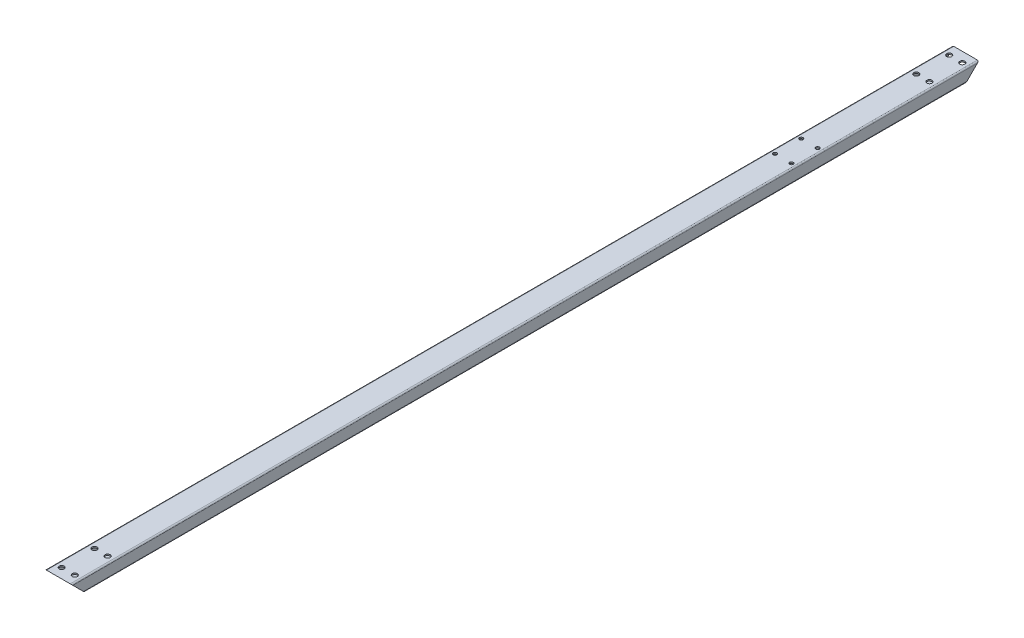
ISO-10303-21;
HEADER;
FILE_DESCRIPTION(('STEP AP214'),'2;1');
FILE_NAME('part.step','',(''),(''),'','','');
FILE_SCHEMA(('AUTOMOTIVE_DESIGN { 1 0 10303 214 1 1 1 1 }'));
ENDSEC;
DATA;
#1=APPLICATION_CONTEXT('core data for automotive mechanical design processes');
#2=APPLICATION_PROTOCOL_DEFINITION('international standard','automotive_design',2000,#1);
#3=PRODUCT_CONTEXT('',#1,'mechanical');
#4=PRODUCT('Part','Part','',(#3));
#5=PRODUCT_RELATED_PRODUCT_CATEGORY('part','',(#4));
#6=PRODUCT_DEFINITION_FORMATION('','',#4);
#7=PRODUCT_DEFINITION_CONTEXT('part definition',#1,'design');
#8=PRODUCT_DEFINITION('design','',#6,#7);
#9=PRODUCT_DEFINITION_SHAPE('','',#8);
#10=(LENGTH_UNIT() NAMED_UNIT(*) SI_UNIT(.MILLI.,.METRE.));
#11=(NAMED_UNIT(*) PLANE_ANGLE_UNIT() SI_UNIT($,.RADIAN.));
#12=(NAMED_UNIT(*) SI_UNIT($,.STERADIAN.) SOLID_ANGLE_UNIT());
#13=UNCERTAINTY_MEASURE_WITH_UNIT(LENGTH_MEASURE(1.E-05),#10,'distance_accuracy_value','');
#14=(GEOMETRIC_REPRESENTATION_CONTEXT(3) GLOBAL_UNCERTAINTY_ASSIGNED_CONTEXT((#13)) GLOBAL_UNIT_ASSIGNED_CONTEXT((#10,
#11,#12)) REPRESENTATION_CONTEXT('',''));
#15=CARTESIAN_POINT('',(0.,0.,0.));
#16=DIRECTION('',(0.,0.,1.));
#17=DIRECTION('',(1.,0.,0.));
#18=AXIS2_PLACEMENT_3D('',#15,#16,#17);
#19=CARTESIAN_POINT('',(-36.,16.,1375.));
#20=DIRECTION('',(-1.,0.,0.));
#21=DIRECTION('',(0.,0.,1.));
#22=AXIS2_PLACEMENT_3D('',#19,#20,#21);
#23=PLANE('',#22);
#24=DIRECTION('',(0.,-1.,0.));
#25=VECTOR('',#24,1.);
#26=CARTESIAN_POINT('',(-36.,16.,1375.));
#27=LINE('',#26,#25);
#28=CARTESIAN_POINT('',(-36.,16.,1375.));
#29=VERTEX_POINT('',#28);
#30=CARTESIAN_POINT('',(-36.,15.0000000000001,1375.));
#31=VERTEX_POINT('',#30);
#32=EDGE_CURVE('E97',#29,#31,#27,.T.);
#33=ORIENTED_EDGE('',*,*,#32,.T.);
#34=DIRECTION('',(0.,0.707106781186551,0.707106781186544));
#35=VECTOR('',#34,1.);
#36=CARTESIAN_POINT('',(-36.,15.5,1375.5));
#37=LINE('',#36,#35);
#38=CARTESIAN_POINT('',(-36.,16.,1376.));
#39=VERTEX_POINT('',#38);
#40=EDGE_CURVE('E62',#31,#39,#37,.T.);
#41=ORIENTED_EDGE('',*,*,#40,.T.);
#42=DIRECTION('',(0.,0.,1.));
#43=VECTOR('',#42,1.);
#44=CARTESIAN_POINT('',(-36.,16.,1375.));
#45=LINE('',#44,#43);
#46=EDGE_CURVE('E56',#29,#39,#45,.T.);
#47=ORIENTED_EDGE('',*,*,#46,.F.);
#48=EDGE_LOOP('',(#33,#41,#47));
#49=FACE_BOUND('',#48,.T.);
#50=ADVANCED_FACE('F49',(#49),#23,.T.);
#51=CARTESIAN_POINT('',(-36.,16.,1375.));
#52=DIRECTION('',(0.,1.,0.));
#53=DIRECTION('',(0.,0.,1.));
#54=AXIS2_PLACEMENT_3D('',#51,#52,#53);
#55=PLANE('',#54);
#56=ORIENTED_EDGE('',*,*,#46,.T.);
#57=DIRECTION('',(1.,0.,0.));
#58=VECTOR('',#57,1.);
#59=CARTESIAN_POINT('',(-36.,16.,1376.));
#60=LINE('',#59,#58);
#61=CARTESIAN_POINT('',(36.,16.,1376.));
#62=VERTEX_POINT('',#61);
#63=EDGE_CURVE('E91',#39,#62,#60,.T.);
#64=ORIENTED_EDGE('',*,*,#63,.T.);
#65=DIRECTION('',(0.,0.,1.));
#66=VECTOR('',#65,1.);
#67=CARTESIAN_POINT('',(36.,16.,1375.));
#68=LINE('',#67,#66);
#69=CARTESIAN_POINT('',(36.,16.,1375.));
#70=VERTEX_POINT('',#69);
#71=EDGE_CURVE('E90',#70,#62,#68,.T.);
#72=ORIENTED_EDGE('',*,*,#71,.F.);
#73=DIRECTION('',(-1.,0.,0.));
#74=VECTOR('',#73,1.);
#75=CARTESIAN_POINT('',(-36.,16.,1375.));
#76=LINE('',#75,#74);
#77=EDGE_CURVE('E96',#70,#29,#76,.T.);
#78=ORIENTED_EDGE('',*,*,#77,.T.);
#79=EDGE_LOOP('',(#56,#64,#72,#78));
#80=FACE_BOUND('',#79,.T.);
#81=ADVANCED_FACE('F104',(#80),#55,.T.);
#82=CARTESIAN_POINT('',(36.,16.,1375.));
#83=DIRECTION('',(1.,0.,0.));
#84=DIRECTION('',(0.,0.,-1.));
#85=AXIS2_PLACEMENT_3D('',#82,#83,#84);
#86=PLANE('',#85);
#87=ORIENTED_EDGE('',*,*,#71,.T.);
#88=DIRECTION('',(0.,-0.707106781186551,-0.707106781186544));
#89=VECTOR('',#88,1.);
#90=CARTESIAN_POINT('',(36.,15.5,1375.5));
#91=LINE('',#90,#89);
#92=CARTESIAN_POINT('',(36.,15.0000000000001,1375.));
#93=VERTEX_POINT('',#92);
#94=EDGE_CURVE('E81',#62,#93,#91,.T.);
#95=ORIENTED_EDGE('',*,*,#94,.T.);
#96=DIRECTION('',(0.,1.,0.));
#97=VECTOR('',#96,1.);
#98=CARTESIAN_POINT('',(36.,16.,1375.));
#99=LINE('',#98,#97);
#100=EDGE_CURVE('E88',#93,#70,#99,.T.);
#101=ORIENTED_EDGE('',*,*,#100,.T.);
#102=EDGE_LOOP('',(#87,#95,#101));
#103=FACE_BOUND('',#102,.T.);
#104=ADVANCED_FACE('F87',(#103),#86,.T.);
#105=CARTESIAN_POINT('',(0.,0.,1375.));
#106=DIRECTION('',(0.,0.,1.));
#107=DIRECTION('',(1.,0.,0.));
#108=AXIS2_PLACEMENT_3D('',#105,#106,#107);
#109=PLANE('',#108);
#110=DIRECTION('',(1.,0.,0.));
#111=VECTOR('',#110,1.);
#112=CARTESIAN_POINT('',(0.,15.0000000000001,1375.));
#113=LINE('',#112,#111);
#114=EDGE_CURVE('E12',#31,#93,#113,.T.);
#115=ORIENTED_EDGE('',*,*,#114,.F.);
#116=ORIENTED_EDGE('',*,*,#32,.F.);
#117=ORIENTED_EDGE('',*,*,#77,.F.);
#118=ORIENTED_EDGE('',*,*,#100,.F.);
#119=EDGE_LOOP('',(#115,#116,#117,#118));
#120=FACE_BOUND('',#119,.T.);
#121=ADVANCED_FACE('F94',(#120),#109,.F.);
#122=CARTESIAN_POINT('',(220.,20.,1380.));
#123=DIRECTION('',(0.,-0.707106781186544,0.707106781186551));
#124=DIRECTION('',(0.,-0.707106781186551,-0.707106781186544));
#125=AXIS2_PLACEMENT_3D('',#122,#123,#124);
#126=PLANE('',#125);
#127=ORIENTED_EDGE('',*,*,#114,.T.);
#128=ORIENTED_EDGE('',*,*,#94,.F.);
#129=ORIENTED_EDGE('',*,*,#63,.F.);
#130=ORIENTED_EDGE('',*,*,#40,.F.);
#131=EDGE_LOOP('',(#127,#128,#129,#130));
#132=FACE_BOUND('',#131,.T.);
#133=ADVANCED_FACE('F80',(#132),#126,.T.);
#134=CLOSED_SHELL('',(#50,#81,#104,#121,#133));
#135=MANIFOLD_SOLID_BREP('B2',#134);
#136=CARTESIAN_POINT('',(36.,16.,-1375.));
#137=DIRECTION('',(1.,0.,0.));
#138=DIRECTION('',(0.,0.,-1.));
#139=AXIS2_PLACEMENT_3D('',#136,#137,#138);
#140=PLANE('',#139);
#141=DIRECTION('',(0.,-1.,0.));
#142=VECTOR('',#141,1.);
#143=CARTESIAN_POINT('',(36.,16.,-1375.));
#144=LINE('',#143,#142);
#145=CARTESIAN_POINT('',(36.,16.,-1375.));
#146=VERTEX_POINT('',#145);
#147=CARTESIAN_POINT('',(36.,15.,-1375.));
#148=VERTEX_POINT('',#147);
#149=EDGE_CURVE('E203',#146,#148,#144,.T.);
#150=ORIENTED_EDGE('',*,*,#149,.T.);
#151=DIRECTION('',(0.,0.707106781186553,-0.707106781186542));
#152=VECTOR('',#151,1.);
#153=CARTESIAN_POINT('',(36.,15.5,-1375.5));
#154=LINE('',#153,#152);
#155=CARTESIAN_POINT('',(36.,16.,-1376.));
#156=VERTEX_POINT('',#155);
#157=EDGE_CURVE('E168',#148,#156,#154,.T.);
#158=ORIENTED_EDGE('',*,*,#157,.T.);
#159=DIRECTION('',(0.,0.,-1.));
#160=VECTOR('',#159,1.);
#161=CARTESIAN_POINT('',(36.,16.,-1375.));
#162=LINE('',#161,#160);
#163=EDGE_CURVE('E162',#146,#156,#162,.T.);
#164=ORIENTED_EDGE('',*,*,#163,.F.);
#165=EDGE_LOOP('',(#150,#158,#164));
#166=FACE_BOUND('',#165,.T.);
#167=ADVANCED_FACE('F155',(#166),#140,.T.);
#168=CARTESIAN_POINT('',(36.,16.,-1375.));
#169=DIRECTION('',(0.,1.,0.));
#170=DIRECTION('',(0.,0.,1.));
#171=AXIS2_PLACEMENT_3D('',#168,#169,#170);
#172=PLANE('',#171);
#173=ORIENTED_EDGE('',*,*,#163,.T.);
#174=DIRECTION('',(-1.,0.,0.));
#175=VECTOR('',#174,1.);
#176=CARTESIAN_POINT('',(36.,16.,-1376.));
#177=LINE('',#176,#175);
#178=CARTESIAN_POINT('',(-36.,16.,-1376.));
#179=VERTEX_POINT('',#178);
#180=EDGE_CURVE('E197',#156,#179,#177,.T.);
#181=ORIENTED_EDGE('',*,*,#180,.T.);
#182=DIRECTION('',(0.,0.,-1.));
#183=VECTOR('',#182,1.);
#184=CARTESIAN_POINT('',(-36.,16.,-1375.));
#185=LINE('',#184,#183);
#186=CARTESIAN_POINT('',(-36.,16.,-1375.));
#187=VERTEX_POINT('',#186);
#188=EDGE_CURVE('E196',#187,#179,#185,.T.);
#189=ORIENTED_EDGE('',*,*,#188,.F.);
#190=DIRECTION('',(1.,0.,0.));
#191=VECTOR('',#190,1.);
#192=CARTESIAN_POINT('',(36.,16.,-1375.));
#193=LINE('',#192,#191);
#194=EDGE_CURVE('E202',#187,#146,#193,.T.);
#195=ORIENTED_EDGE('',*,*,#194,.T.);
#196=EDGE_LOOP('',(#173,#181,#189,#195));
#197=FACE_BOUND('',#196,.T.);
#198=ADVANCED_FACE('F210',(#197),#172,.T.);
#199=CARTESIAN_POINT('',(-36.,16.,-1375.));
#200=DIRECTION('',(-1.,0.,0.));
#201=DIRECTION('',(0.,0.,1.));
#202=AXIS2_PLACEMENT_3D('',#199,#200,#201);
#203=PLANE('',#202);
#204=ORIENTED_EDGE('',*,*,#188,.T.);
#205=DIRECTION('',(0.,-0.707106781186553,0.707106781186542));
#206=VECTOR('',#205,1.);
#207=CARTESIAN_POINT('',(-36.,15.5,-1375.5));
#208=LINE('',#207,#206);
#209=CARTESIAN_POINT('',(-36.,15.,-1375.));
#210=VERTEX_POINT('',#209);
#211=EDGE_CURVE('E187',#179,#210,#208,.T.);
#212=ORIENTED_EDGE('',*,*,#211,.T.);
#213=DIRECTION('',(0.,1.,0.));
#214=VECTOR('',#213,1.);
#215=CARTESIAN_POINT('',(-36.,16.,-1375.));
#216=LINE('',#215,#214);
#217=EDGE_CURVE('E194',#210,#187,#216,.T.);
#218=ORIENTED_EDGE('',*,*,#217,.T.);
#219=EDGE_LOOP('',(#204,#212,#218));
#220=FACE_BOUND('',#219,.T.);
#221=ADVANCED_FACE('F193',(#220),#203,.T.);
#222=CARTESIAN_POINT('',(0.,0.,-1375.));
#223=DIRECTION('',(0.,0.,-1.));
#224=DIRECTION('',(-1.,0.,0.));
#225=AXIS2_PLACEMENT_3D('',#222,#223,#224);
#226=PLANE('',#225);
#227=DIRECTION('',(-1.,0.,0.));
#228=VECTOR('',#227,1.);
#229=CARTESIAN_POINT('',(0.,15.,-1375.));
#230=LINE('',#229,#228);
#231=EDGE_CURVE('E47',#148,#210,#230,.T.);
#232=ORIENTED_EDGE('',*,*,#231,.F.);
#233=ORIENTED_EDGE('',*,*,#149,.F.);
#234=ORIENTED_EDGE('',*,*,#194,.F.);
#235=ORIENTED_EDGE('',*,*,#217,.F.);
#236=EDGE_LOOP('',(#232,#233,#234,#235));
#237=FACE_BOUND('',#236,.T.);
#238=ADVANCED_FACE('F200',(#237),#226,.F.);
#239=CARTESIAN_POINT('',(220.,-20.,-1340.));
#240=DIRECTION('',(0.,-0.707106781186542,-0.707106781186553));
#241=DIRECTION('',(0.,0.707106781186553,-0.707106781186542));
#242=AXIS2_PLACEMENT_3D('',#239,#240,#241);
#243=PLANE('',#242);
#244=ORIENTED_EDGE('',*,*,#231,.T.);
#245=ORIENTED_EDGE('',*,*,#211,.F.);
#246=ORIENTED_EDGE('',*,*,#180,.F.);
#247=ORIENTED_EDGE('',*,*,#157,.F.);
#248=EDGE_LOOP('',(#244,#245,#246,#247));
#249=FACE_BOUND('',#248,.T.);
#250=ADVANCED_FACE('F186',(#249),#243,.T.);
#251=CLOSED_SHELL('',(#167,#198,#221,#238,#250));
#252=MANIFOLD_SOLID_BREP('B6',#251);
#253=CARTESIAN_POINT('',(36.,16.,-1380.));
#254=DIRECTION('',(0.,0.,1.));
#255=DIRECTION('',(1.,0.,0.));
#256=AXIS2_PLACEMENT_3D('',#253,#254,#255);
#257=CYLINDRICAL_SURFACE('',#256,4.);
#258=DIRECTION('',(0.,0.,1.));
#259=VECTOR('',#258,1.);
#260=CARTESIAN_POINT('',(36.,20.,-1380.));
#261=LINE('',#260,#259);
#262=CARTESIAN_POINT('',(36.,20.,-1380.));
#263=VERTEX_POINT('',#262);
#264=CARTESIAN_POINT('',(36.,20.,1380.));
#265=VERTEX_POINT('',#264);
#266=EDGE_CURVE('E379',#263,#265,#261,.T.);
#267=ORIENTED_EDGE('',*,*,#266,.T.);
#268=CARTESIAN_POINT('',(36.,16.,1376.));
#269=DIRECTION('',(0.,-0.707106781186544,0.707106781186551));
#270=DIRECTION('',(0.,0.707106781186551,0.707106781186544));
#271=AXIS2_PLACEMENT_3D('',#268,#269,#270);
#272=ELLIPSE('',#271,5.65685424949235,4.);
#273=CARTESIAN_POINT('',(40.,15.9999999999998,1376.));
#274=VERTEX_POINT('',#273);
#275=EDGE_CURVE('E472',#265,#274,#272,.F.);
#276=ORIENTED_EDGE('',*,*,#275,.T.);
#277=DIRECTION('',(0.,0.,1.));
#278=VECTOR('',#277,1.);
#279=CARTESIAN_POINT('',(40.,16.,-1380.));
#280=LINE('',#279,#278);
#281=CARTESIAN_POINT('',(40.,16.,-1376.));
#282=VERTEX_POINT('',#281);
#283=EDGE_CURVE('E259',#282,#274,#280,.T.);
#284=ORIENTED_EDGE('',*,*,#283,.F.);
#285=CARTESIAN_POINT('',(36.,16.,-1376.));
#286=DIRECTION('',(0.,-0.707106781186542,-0.707106781186553));
#287=DIRECTION('',(0.,-0.707106781186553,0.707106781186542));
#288=AXIS2_PLACEMENT_3D('',#285,#286,#287);
#289=ELLIPSE('',#288,5.65685424949233,4.);
#290=EDGE_CURVE('E470',#282,#263,#289,.F.);
#291=ORIENTED_EDGE('',*,*,#290,.T.);
#292=EDGE_LOOP('',(#267,#276,#284,#291));
#293=FACE_BOUND('',#292,.T.);
#294=ADVANCED_FACE('F252',(#293),#257,.T.);
#295=CARTESIAN_POINT('',(40.,16.,-1380.));
#296=DIRECTION('',(1.,0.,0.));
#297=DIRECTION('',(0.,1.,0.));
#298=AXIS2_PLACEMENT_3D('',#295,#296,#297);
#299=PLANE('',#298);
#300=ORIENTED_EDGE('',*,*,#283,.T.);
#301=DIRECTION('',(0.,-0.707106781186551,-0.707106781186544));
#302=VECTOR('',#301,1.);
#303=CARTESIAN_POINT('',(40.0000000000006,-1362.,-1.99999999998579));
#304=LINE('',#303,#302);
#305=CARTESIAN_POINT('',(40.,-16.,1344.));
#306=VERTEX_POINT('',#305);
#307=EDGE_CURVE('E360',#274,#306,#304,.T.);
#308=ORIENTED_EDGE('',*,*,#307,.T.);
#309=DIRECTION('',(0.,0.,1.));
#310=VECTOR('',#309,1.);
#311=CARTESIAN_POINT('',(40.,-16.,-1380.));
#312=LINE('',#311,#310);
#313=CARTESIAN_POINT('',(40.,-16.,-1344.));
#314=VERTEX_POINT('',#313);
#315=EDGE_CURVE('E359',#314,#306,#312,.T.);
#316=ORIENTED_EDGE('',*,*,#315,.F.);
#317=DIRECTION('',(0.,0.707106781186553,-0.707106781186542));
#318=VECTOR('',#317,1.);
#319=CARTESIAN_POINT('',(40.,18.,-1378.));
#320=LINE('',#319,#318);
#321=EDGE_CURVE('E466',#314,#282,#320,.T.);
#322=ORIENTED_EDGE('',*,*,#321,.T.);
#323=EDGE_LOOP('',(#300,#308,#316,#322));
#324=FACE_BOUND('',#323,.T.);
#325=ADVANCED_FACE('F465',(#324),#299,.T.);
#326=CARTESIAN_POINT('',(36.,-16.,-1380.));
#327=DIRECTION('',(0.,0.,1.));
#328=DIRECTION('',(1.,0.,0.));
#329=AXIS2_PLACEMENT_3D('',#326,#327,#328);
#330=CYLINDRICAL_SURFACE('',#329,4.);
#331=ORIENTED_EDGE('',*,*,#315,.T.);
#332=CARTESIAN_POINT('',(36.,-16.,1344.));
#333=DIRECTION('',(0.,-0.707106781186544,0.707106781186551));
#334=DIRECTION('',(0.,0.707106781186551,0.707106781186544));
#335=AXIS2_PLACEMENT_3D('',#332,#333,#334);
#336=ELLIPSE('',#335,5.65685424949235,4.);
#337=CARTESIAN_POINT('',(36.,-20.,1340.));
#338=VERTEX_POINT('',#337);
#339=EDGE_CURVE('E341',#306,#338,#336,.F.);
#340=ORIENTED_EDGE('',*,*,#339,.T.);
#341=DIRECTION('',(0.,0.,1.));
#342=VECTOR('',#341,1.);
#343=CARTESIAN_POINT('',(36.,-20.,-1380.));
#344=LINE('',#343,#342);
#345=CARTESIAN_POINT('',(36.,-20.,-1340.));
#346=VERTEX_POINT('',#345);
#347=EDGE_CURVE('E357',#346,#338,#344,.T.);
#348=ORIENTED_EDGE('',*,*,#347,.F.);
#349=CARTESIAN_POINT('',(36.,-16.,-1344.));
#350=DIRECTION('',(0.,-0.707106781186542,-0.707106781186553));
#351=DIRECTION('',(0.,-0.707106781186553,0.707106781186542));
#352=AXIS2_PLACEMENT_3D('',#349,#350,#351);
#353=ELLIPSE('',#352,5.65685424949234,4.);
#354=EDGE_CURVE('E491',#346,#314,#353,.F.);
#355=ORIENTED_EDGE('',*,*,#354,.T.);
#356=EDGE_LOOP('',(#331,#340,#348,#355));
#357=FACE_BOUND('',#356,.T.);
#358=ADVANCED_FACE('F355',(#357),#330,.T.);
#359=CARTESIAN_POINT('',(-36.,-20.,-1380.));
#360=DIRECTION('',(0.,-1.,0.));
#361=DIRECTION('',(0.,0.,-1.));
#362=AXIS2_PLACEMENT_3D('',#359,#360,#361);
#363=PLANE('',#362);
#364=ORIENTED_EDGE('',*,*,#347,.T.);
#365=DIRECTION('',(-1.,0.,0.));
#366=VECTOR('',#365,1.);
#367=CARTESIAN_POINT('',(220.,-20.,1340.));
#368=LINE('',#367,#366);
#369=CARTESIAN_POINT('',(-36.,-20.,1340.));
#370=VERTEX_POINT('',#369);
#371=EDGE_CURVE('E338',#338,#370,#368,.T.);
#372=ORIENTED_EDGE('',*,*,#371,.T.);
#373=DIRECTION('',(0.,0.,1.));
#374=VECTOR('',#373,1.);
#375=CARTESIAN_POINT('',(-36.,-20.,-1380.));
#376=LINE('',#375,#374);
#377=CARTESIAN_POINT('',(-36.,-20.,-1340.));
#378=VERTEX_POINT('',#377);
#379=EDGE_CURVE('E364',#378,#370,#376,.T.);
#380=ORIENTED_EDGE('',*,*,#379,.F.);
#381=DIRECTION('',(-1.,0.,0.));
#382=VECTOR('',#381,1.);
#383=CARTESIAN_POINT('',(220.,-20.,-1340.));
#384=LINE('',#383,#382);
#385=EDGE_CURVE('E350',#346,#378,#384,.T.);
#386=ORIENTED_EDGE('',*,*,#385,.F.);
#387=EDGE_LOOP('',(#364,#372,#380,#386));
#388=FACE_BOUND('',#387,.T.);
#389=ADVANCED_FACE('F363',(#388),#363,.T.);
#390=CARTESIAN_POINT('',(-36.,-16.,-1380.));
#391=DIRECTION('',(0.,0.,1.));
#392=DIRECTION('',(1.,0.,0.));
#393=AXIS2_PLACEMENT_3D('',#390,#391,#392);
#394=CYLINDRICAL_SURFACE('',#393,4.);
#395=ORIENTED_EDGE('',*,*,#379,.T.);
#396=CARTESIAN_POINT('',(-36.,-16.,1344.));
#397=DIRECTION('',(0.,-0.707106781186544,0.707106781186551));
#398=DIRECTION('',(0.,0.707106781186551,0.707106781186544));
#399=AXIS2_PLACEMENT_3D('',#396,#397,#398);
#400=ELLIPSE('',#399,5.65685424949235,4.);
#401=CARTESIAN_POINT('',(-40.,-15.9999999999998,1344.));
#402=VERTEX_POINT('',#401);
#403=EDGE_CURVE('E344',#370,#402,#400,.F.);
#404=ORIENTED_EDGE('',*,*,#403,.T.);
#405=DIRECTION('',(0.,0.,1.));
#406=VECTOR('',#405,1.);
#407=CARTESIAN_POINT('',(-40.,-16.,-1380.));
#408=LINE('',#407,#406);
#409=CARTESIAN_POINT('',(-40.,-16.,-1344.));
#410=VERTEX_POINT('',#409);
#411=EDGE_CURVE('E367',#410,#402,#408,.T.);
#412=ORIENTED_EDGE('',*,*,#411,.F.);
#413=CARTESIAN_POINT('',(-36.,-16.,-1344.));
#414=DIRECTION('',(0.,-0.707106781186542,-0.707106781186553));
#415=DIRECTION('',(0.,-0.707106781186553,0.707106781186542));
#416=AXIS2_PLACEMENT_3D('',#413,#414,#415);
#417=ELLIPSE('',#416,5.65685424949234,4.);
#418=EDGE_CURVE('E488',#410,#378,#417,.F.);
#419=ORIENTED_EDGE('',*,*,#418,.T.);
#420=EDGE_LOOP('',(#395,#404,#412,#419));
#421=FACE_BOUND('',#420,.T.);
#422=ADVANCED_FACE('F539',(#421),#394,.T.);
#423=CARTESIAN_POINT('',(-40.,16.,-1380.));
#424=DIRECTION('',(-1.,0.,0.));
#425=DIRECTION('',(0.,-1.,0.));
#426=AXIS2_PLACEMENT_3D('',#423,#424,#425);
#427=PLANE('',#426);
#428=ORIENTED_EDGE('',*,*,#411,.T.);
#429=DIRECTION('',(0.,0.707106781186551,0.707106781186544));
#430=VECTOR('',#429,1.);
#431=CARTESIAN_POINT('',(-39.9999999999997,-1362.,-1.99999999998579));
#432=LINE('',#431,#430);
#433=CARTESIAN_POINT('',(-40.,16.,1376.));
#434=VERTEX_POINT('',#433);
#435=EDGE_CURVE('E529',#402,#434,#432,.T.);
#436=ORIENTED_EDGE('',*,*,#435,.T.);
#437=DIRECTION('',(0.,0.,1.));
#438=VECTOR('',#437,1.);
#439=CARTESIAN_POINT('',(-40.,16.,-1380.));
#440=LINE('',#439,#438);
#441=CARTESIAN_POINT('',(-40.,16.,-1376.));
#442=VERTEX_POINT('',#441);
#443=EDGE_CURVE('E373',#442,#434,#440,.T.);
#444=ORIENTED_EDGE('',*,*,#443,.F.);
#445=DIRECTION('',(0.,-0.707106781186553,0.707106781186542));
#446=VECTOR('',#445,1.);
#447=CARTESIAN_POINT('',(-40.,18.,-1378.));
#448=LINE('',#447,#446);
#449=EDGE_CURVE('E485',#442,#410,#448,.T.);
#450=ORIENTED_EDGE('',*,*,#449,.T.);
#451=EDGE_LOOP('',(#428,#436,#444,#450));
#452=FACE_BOUND('',#451,.T.);
#453=ADVANCED_FACE('F541',(#452),#427,.T.);
#454=CARTESIAN_POINT('',(-36.,16.,-1380.));
#455=DIRECTION('',(0.,0.,1.));
#456=DIRECTION('',(1.,0.,0.));
#457=AXIS2_PLACEMENT_3D('',#454,#455,#456);
#458=CYLINDRICAL_SURFACE('',#457,4.);
#459=ORIENTED_EDGE('',*,*,#443,.T.);
#460=CARTESIAN_POINT('',(-36.,16.,1376.));
#461=DIRECTION('',(0.,-0.707106781186544,0.707106781186551));
#462=DIRECTION('',(0.,0.707106781186551,0.707106781186544));
#463=AXIS2_PLACEMENT_3D('',#460,#461,#462);
#464=ELLIPSE('',#463,5.65685424949235,4.);
#465=CARTESIAN_POINT('',(-36.,20.,1380.));
#466=VERTEX_POINT('',#465);
#467=EDGE_CURVE('E527',#434,#466,#464,.F.);
#468=ORIENTED_EDGE('',*,*,#467,.T.);
#469=DIRECTION('',(0.,0.,1.));
#470=VECTOR('',#469,1.);
#471=CARTESIAN_POINT('',(-36.,20.,-1380.));
#472=LINE('',#471,#470);
#473=CARTESIAN_POINT('',(-36.,20.,-1380.));
#474=VERTEX_POINT('',#473);
#475=EDGE_CURVE('E376',#474,#466,#472,.T.);
#476=ORIENTED_EDGE('',*,*,#475,.F.);
#477=CARTESIAN_POINT('',(-36.,16.,-1376.));
#478=DIRECTION('',(0.,-0.707106781186542,-0.707106781186553));
#479=DIRECTION('',(0.,-0.707106781186553,0.707106781186542));
#480=AXIS2_PLACEMENT_3D('',#477,#478,#479);
#481=ELLIPSE('',#480,5.65685424949234,4.);
#482=EDGE_CURVE('E482',#474,#442,#481,.F.);
#483=ORIENTED_EDGE('',*,*,#482,.T.);
#484=EDGE_LOOP('',(#459,#468,#476,#483));
#485=FACE_BOUND('',#484,.T.);
#486=ADVANCED_FACE('F525',(#485),#458,.T.);
#487=CARTESIAN_POINT('',(-36.,16.,-1380.));
#488=DIRECTION('',(0.,1.,0.));
#489=DIRECTION('',(0.,0.,1.));
#490=AXIS2_PLACEMENT_3D('',#487,#488,#489);
#491=PLANE('',#490);
#492=CARTESIAN_POINT('',(-25.,16.,-905.));
#493=DIRECTION('',(0.,1.,0.));
#494=DIRECTION('',(0.,0.,1.));
#495=AXIS2_PLACEMENT_3D('',#492,#493,#494);
#496=CIRCLE('',#495,5.49999999999998);
#497=CARTESIAN_POINT('',(-25.,16.,-899.5));
#498=VERTEX_POINT('',#497);
#499=EDGE_CURVE('E418',#498,#498,#496,.T.);
#500=ORIENTED_EDGE('',*,*,#499,.T.);
#501=EDGE_LOOP('',(#500));
#502=FACE_BOUND('',#501,.T.);
#503=CARTESIAN_POINT('',(25.,16.,-825.));
#504=DIRECTION('',(0.,1.,0.));
#505=DIRECTION('',(0.,0.,1.));
#506=AXIS2_PLACEMENT_3D('',#503,#504,#505);
#507=CIRCLE('',#506,5.50000000000001);
#508=CARTESIAN_POINT('',(25.,16.,-819.5));
#509=VERTEX_POINT('',#508);
#510=EDGE_CURVE('E416',#509,#509,#507,.T.);
#511=ORIENTED_EDGE('',*,*,#510,.T.);
#512=EDGE_LOOP('',(#511));
#513=FACE_BOUND('',#512,.T.);
#514=CARTESIAN_POINT('',(-25.,16.,-825.));
#515=DIRECTION('',(0.,1.,0.));
#516=DIRECTION('',(0.,0.,1.));
#517=AXIS2_PLACEMENT_3D('',#514,#515,#516);
#518=CIRCLE('',#517,5.50000000000001);
#519=CARTESIAN_POINT('',(-25.,16.,-819.5));
#520=VERTEX_POINT('',#519);
#521=EDGE_CURVE('E412',#520,#520,#518,.T.);
#522=ORIENTED_EDGE('',*,*,#521,.T.);
#523=EDGE_LOOP('',(#522));
#524=FACE_BOUND('',#523,.T.);
#525=CARTESIAN_POINT('',(25.,16.,-905.));
#526=DIRECTION('',(0.,1.,0.));
#527=DIRECTION('',(0.,0.,1.));
#528=AXIS2_PLACEMENT_3D('',#525,#526,#527);
#529=CIRCLE('',#528,5.49999999999998);
#530=CARTESIAN_POINT('',(25.,16.,-899.5));
#531=VERTEX_POINT('',#530);
#532=EDGE_CURVE('E409',#531,#531,#529,.T.);
#533=ORIENTED_EDGE('',*,*,#532,.T.);
#534=EDGE_LOOP('',(#533));
#535=FACE_BOUND('',#534,.T.);
#536=CARTESIAN_POINT('',(20.,16.,-1350.));
#537=DIRECTION('',(0.,1.,0.));
#538=DIRECTION('',(0.,0.,1.));
#539=AXIS2_PLACEMENT_3D('',#536,#537,#538);
#540=CIRCLE('',#539,7.74999999999994);
#541=CARTESIAN_POINT('',(20.,16.,-1342.25));
#542=VERTEX_POINT('',#541);
#543=EDGE_CURVE('E405',#542,#542,#540,.T.);
#544=ORIENTED_EDGE('',*,*,#543,.T.);
#545=EDGE_LOOP('',(#544));
#546=FACE_BOUND('',#545,.T.);
#547=CARTESIAN_POINT('',(20.,16.,-1250.));
#548=DIRECTION('',(0.,1.,0.));
#549=DIRECTION('',(0.,0.,1.));
#550=AXIS2_PLACEMENT_3D('',#547,#548,#549);
#551=CIRCLE('',#550,7.74999999999994);
#552=CARTESIAN_POINT('',(20.,16.,-1242.25));
#553=VERTEX_POINT('',#552);
#554=EDGE_CURVE('E402',#553,#553,#551,.T.);
#555=ORIENTED_EDGE('',*,*,#554,.T.);
#556=EDGE_LOOP('',(#555));
#557=FACE_BOUND('',#556,.T.);
#558=CARTESIAN_POINT('',(-20.,16.,-1250.));
#559=DIRECTION('',(0.,1.,0.));
#560=DIRECTION('',(0.,0.,1.));
#561=AXIS2_PLACEMENT_3D('',#558,#559,#560);
#562=CIRCLE('',#561,7.74999999999994);
#563=CARTESIAN_POINT('',(-20.,16.,-1242.25));
#564=VERTEX_POINT('',#563);
#565=EDGE_CURVE('E399',#564,#564,#562,.T.);
#566=ORIENTED_EDGE('',*,*,#565,.T.);
#567=EDGE_LOOP('',(#566));
#568=FACE_BOUND('',#567,.T.);
#569=CARTESIAN_POINT('',(-20.,16.,1250.));
#570=DIRECTION('',(0.,1.,0.));
#571=DIRECTION('',(0.,0.,1.));
#572=AXIS2_PLACEMENT_3D('',#569,#570,#571);
#573=CIRCLE('',#572,7.74999999999994);
#574=CARTESIAN_POINT('',(-20.,16.,1257.75));
#575=VERTEX_POINT('',#574);
#576=EDGE_CURVE('E396',#575,#575,#573,.T.);
#577=ORIENTED_EDGE('',*,*,#576,.T.);
#578=EDGE_LOOP('',(#577));
#579=FACE_BOUND('',#578,.T.);
#580=CARTESIAN_POINT('',(20.,16.,1250.));
#581=DIRECTION('',(0.,1.,0.));
#582=DIRECTION('',(0.,0.,1.));
#583=AXIS2_PLACEMENT_3D('',#580,#581,#582);
#584=CIRCLE('',#583,7.74999999999994);
#585=CARTESIAN_POINT('',(20.,16.,1257.75));
#586=VERTEX_POINT('',#585);
#587=EDGE_CURVE('E393',#586,#586,#584,.T.);
#588=ORIENTED_EDGE('',*,*,#587,.T.);
#589=EDGE_LOOP('',(#588));
#590=FACE_BOUND('',#589,.T.);
#591=CARTESIAN_POINT('',(20.,16.,1350.));
#592=DIRECTION('',(0.,1.,0.));
#593=DIRECTION('',(0.,0.,1.));
#594=AXIS2_PLACEMENT_3D('',#591,#592,#593);
#595=CIRCLE('',#594,7.74999999999994);
#596=CARTESIAN_POINT('',(20.,16.,1357.75));
#597=VERTEX_POINT('',#596);
#598=EDGE_CURVE('E390',#597,#597,#595,.T.);
#599=ORIENTED_EDGE('',*,*,#598,.T.);
#600=EDGE_LOOP('',(#599));
#601=FACE_BOUND('',#600,.T.);
#602=CARTESIAN_POINT('',(-20.,16.,1350.));
#603=DIRECTION('',(0.,1.,0.));
#604=DIRECTION('',(0.,0.,1.));
#605=AXIS2_PLACEMENT_3D('',#602,#603,#604);
#606=CIRCLE('',#605,7.74999999999994);
#607=CARTESIAN_POINT('',(-20.,16.,1357.75));
#608=VERTEX_POINT('',#607);
#609=EDGE_CURVE('E386',#608,#608,#606,.T.);
#610=ORIENTED_EDGE('',*,*,#609,.T.);
#611=EDGE_LOOP('',(#610));
#612=FACE_BOUND('',#611,.T.);
#613=CARTESIAN_POINT('',(-20.,16.,-1350.));
#614=DIRECTION('',(0.,1.,0.));
#615=DIRECTION('',(0.,0.,1.));
#616=AXIS2_PLACEMENT_3D('',#613,#614,#615);
#617=CIRCLE('',#616,7.74999999999994);
#618=CARTESIAN_POINT('',(-20.,16.,-1342.25));
#619=VERTEX_POINT('',#618);
#620=EDGE_CURVE('E383',#619,#619,#617,.T.);
#621=ORIENTED_EDGE('',*,*,#620,.T.);
#622=EDGE_LOOP('',(#621));
#623=FACE_BOUND('',#622,.T.);
#624=DIRECTION('',(1.,0.,0.));
#625=VECTOR('',#624,1.);
#626=CARTESIAN_POINT('',(-36.,16.,1376.));
#627=LINE('',#626,#625);
#628=CARTESIAN_POINT('',(-36.,15.9999999999998,1376.));
#629=VERTEX_POINT('',#628);
#630=CARTESIAN_POINT('',(36.,15.9999999999998,1376.));
#631=VERTEX_POINT('',#630);
#632=EDGE_CURVE('E530',#629,#631,#627,.T.);
#633=ORIENTED_EDGE('',*,*,#632,.F.);
#634=DIRECTION('',(0.,0.,1.));
#635=VECTOR('',#634,1.);
#636=CARTESIAN_POINT('',(-36.,16.,-1380.));
#637=LINE('',#636,#635);
#638=CARTESIAN_POINT('',(-36.,16.,-1376.));
#639=VERTEX_POINT('',#638);
#640=EDGE_CURVE('E448',#639,#629,#637,.T.);
#641=ORIENTED_EDGE('',*,*,#640,.F.);
#642=DIRECTION('',(-1.,0.,0.));
#643=VECTOR('',#642,1.);
#644=CARTESIAN_POINT('',(-36.,16.,-1376.));
#645=LINE('',#644,#643);
#646=CARTESIAN_POINT('',(36.,16.,-1376.));
#647=VERTEX_POINT('',#646);
#648=EDGE_CURVE('E273',#647,#639,#645,.T.);
#649=ORIENTED_EDGE('',*,*,#648,.F.);
#650=DIRECTION('',(0.,0.,1.));
#651=VECTOR('',#650,1.);
#652=CARTESIAN_POINT('',(36.,16.,-1380.));
#653=LINE('',#652,#651);
#654=EDGE_CURVE('E449',#647,#631,#653,.T.);
#655=ORIENTED_EDGE('',*,*,#654,.T.);
#656=EDGE_LOOP('',(#633,#641,#649,#655));
#657=FACE_BOUND('',#656,.T.);
#658=ADVANCED_FACE('F560',(#502,#513,#524,#535,#546,#557,#568,#579,#590,#601,#612,#623,#657),
#491,.F.);
#659=CARTESIAN_POINT('',(36.,16.,-1380.));
#660=DIRECTION('',(1.,0.,0.));
#661=DIRECTION('',(0.,1.,0.));
#662=AXIS2_PLACEMENT_3D('',#659,#660,#661);
#663=PLANE('',#662);
#664=DIRECTION('',(0.,-0.707106781186551,-0.707106781186544));
#665=VECTOR('',#664,1.);
#666=CARTESIAN_POINT('',(36.0000000000003,-1362.,-1.99999999998579));
#667=LINE('',#666,#665);
#668=CARTESIAN_POINT('',(36.,-16.,1344.));
#669=VERTEX_POINT('',#668);
#670=EDGE_CURVE('E533',#631,#669,#667,.T.);
#671=ORIENTED_EDGE('',*,*,#670,.F.);
#672=ORIENTED_EDGE('',*,*,#654,.F.);
#673=DIRECTION('',(0.,0.707106781186553,-0.707106781186542));
#674=VECTOR('',#673,1.);
#675=CARTESIAN_POINT('',(36.,18.,-1378.));
#676=LINE('',#675,#674);
#677=CARTESIAN_POINT('',(36.,-16.,-1344.));
#678=VERTEX_POINT('',#677);
#679=EDGE_CURVE('E476',#678,#647,#676,.T.);
#680=ORIENTED_EDGE('',*,*,#679,.F.);
#681=DIRECTION('',(0.,0.,1.));
#682=VECTOR('',#681,1.);
#683=CARTESIAN_POINT('',(36.,-16.,-1380.));
#684=LINE('',#683,#682);
#685=EDGE_CURVE('E452',#678,#669,#684,.T.);
#686=ORIENTED_EDGE('',*,*,#685,.T.);
#687=EDGE_LOOP('',(#671,#672,#680,#686));
#688=FACE_BOUND('',#687,.T.);
#689=ADVANCED_FACE('F557',(#688),#663,.F.);
#690=CARTESIAN_POINT('',(-36.,-16.,-1380.));
#691=DIRECTION('',(0.,-1.,0.));
#692=DIRECTION('',(0.,0.,-1.));
#693=AXIS2_PLACEMENT_3D('',#690,#691,#692);
#694=PLANE('',#693);
#695=DIRECTION('',(-1.,0.,0.));
#696=VECTOR('',#695,1.);
#697=CARTESIAN_POINT('',(-36.,-16.,1344.));
#698=LINE('',#697,#696);
#699=CARTESIAN_POINT('',(-36.,-16.,1344.));
#700=VERTEX_POINT('',#699);
#701=EDGE_CURVE('E266',#669,#700,#698,.T.);
#702=ORIENTED_EDGE('',*,*,#701,.F.);
#703=ORIENTED_EDGE('',*,*,#685,.F.);
#704=DIRECTION('',(1.,0.,0.));
#705=VECTOR('',#704,1.);
#706=CARTESIAN_POINT('',(-36.,-16.,-1344.));
#707=LINE('',#706,#705);
#708=CARTESIAN_POINT('',(-36.,-16.,-1344.));
#709=VERTEX_POINT('',#708);
#710=EDGE_CURVE('E474',#709,#678,#707,.T.);
#711=ORIENTED_EDGE('',*,*,#710,.F.);
#712=DIRECTION('',(0.,0.,1.));
#713=VECTOR('',#712,1.);
#714=CARTESIAN_POINT('',(-36.,-16.,-1380.));
#715=LINE('',#714,#713);
#716=EDGE_CURVE('E455',#709,#700,#715,.T.);
#717=ORIENTED_EDGE('',*,*,#716,.T.);
#718=EDGE_LOOP('',(#702,#703,#711,#717));
#719=FACE_BOUND('',#718,.T.);
#720=ADVANCED_FACE('F553',(#719),#694,.F.);
#721=CARTESIAN_POINT('',(-36.,16.,-1380.));
#722=DIRECTION('',(-1.,0.,0.));
#723=DIRECTION('',(0.,-1.,0.));
#724=AXIS2_PLACEMENT_3D('',#721,#722,#723);
#725=PLANE('',#724);
#726=DIRECTION('',(0.,0.707106781186551,0.707106781186544));
#727=VECTOR('',#726,1.);
#728=CARTESIAN_POINT('',(-35.9999999999997,-1362.,-1.99999999998579));
#729=LINE('',#728,#727);
#730=EDGE_CURVE('E349',#700,#629,#729,.T.);
#731=ORIENTED_EDGE('',*,*,#730,.F.);
#732=ORIENTED_EDGE('',*,*,#716,.F.);
#733=DIRECTION('',(0.,-0.707106781186553,0.707106781186542));
#734=VECTOR('',#733,1.);
#735=CARTESIAN_POINT('',(-36.,18.,-1378.));
#736=LINE('',#735,#734);
#737=EDGE_CURVE('E153',#639,#709,#736,.T.);
#738=ORIENTED_EDGE('',*,*,#737,.F.);
#739=ORIENTED_EDGE('',*,*,#640,.T.);
#740=EDGE_LOOP('',(#731,#732,#738,#739));
#741=FACE_BOUND('',#740,.T.);
#742=ADVANCED_FACE('F515',(#741),#725,.F.);
#743=CARTESIAN_POINT('',(-36.,20.,-1380.));
#744=DIRECTION('',(0.,1.,0.));
#745=DIRECTION('',(0.,0.,1.));
#746=AXIS2_PLACEMENT_3D('',#743,#744,#745);
#747=PLANE('',#746);
#748=CARTESIAN_POINT('',(-25.,20.,-905.));
#749=DIRECTION('',(0.,1.,0.));
#750=DIRECTION('',(0.,0.,1.));
#751=AXIS2_PLACEMENT_3D('',#748,#749,#750);
#752=CIRCLE('',#751,5.49999999999998);
#753=CARTESIAN_POINT('',(-25.,20.,-899.5));
#754=VERTEX_POINT('',#753);
#755=EDGE_CURVE('E499',#754,#754,#752,.T.);
#756=ORIENTED_EDGE('',*,*,#755,.F.);
#757=EDGE_LOOP('',(#756));
#758=FACE_BOUND('',#757,.T.);
#759=CARTESIAN_POINT('',(25.,20.,-825.));
#760=DIRECTION('',(0.,1.,0.));
#761=DIRECTION('',(0.,0.,1.));
#762=AXIS2_PLACEMENT_3D('',#759,#760,#761);
#763=CIRCLE('',#762,5.50000000000001);
#764=CARTESIAN_POINT('',(25.,20.,-819.5));
#765=VERTEX_POINT('',#764);
#766=EDGE_CURVE('E498',#765,#765,#763,.T.);
#767=ORIENTED_EDGE('',*,*,#766,.F.);
#768=EDGE_LOOP('',(#767));
#769=FACE_BOUND('',#768,.T.);
#770=CARTESIAN_POINT('',(-25.,20.,-825.));
#771=DIRECTION('',(0.,1.,0.));
#772=DIRECTION('',(0.,0.,1.));
#773=AXIS2_PLACEMENT_3D('',#770,#771,#772);
#774=CIRCLE('',#773,5.50000000000001);
#775=CARTESIAN_POINT('',(-25.,20.,-819.5));
#776=VERTEX_POINT('',#775);
#777=EDGE_CURVE('E495',#776,#776,#774,.T.);
#778=ORIENTED_EDGE('',*,*,#777,.F.);
#779=EDGE_LOOP('',(#778));
#780=FACE_BOUND('',#779,.T.);
#781=CARTESIAN_POINT('',(25.,20.,-905.));
#782=DIRECTION('',(0.,1.,0.));
#783=DIRECTION('',(0.,0.,1.));
#784=AXIS2_PLACEMENT_3D('',#781,#782,#783);
#785=CIRCLE('',#784,5.49999999999998);
#786=CARTESIAN_POINT('',(25.,20.,-899.5));
#787=VERTEX_POINT('',#786);
#788=EDGE_CURVE('E413',#787,#787,#785,.T.);
#789=ORIENTED_EDGE('',*,*,#788,.F.);
#790=EDGE_LOOP('',(#789));
#791=FACE_BOUND('',#790,.T.);
#792=CARTESIAN_POINT('',(20.,20.,-1350.));
#793=DIRECTION('',(0.,1.,0.));
#794=DIRECTION('',(0.,0.,1.));
#795=AXIS2_PLACEMENT_3D('',#792,#793,#794);
#796=CIRCLE('',#795,7.74999999999994);
#797=CARTESIAN_POINT('',(20.,20.,-1342.25));
#798=VERTEX_POINT('',#797);
#799=EDGE_CURVE('E433',#798,#798,#796,.T.);
#800=ORIENTED_EDGE('',*,*,#799,.F.);
#801=EDGE_LOOP('',(#800));
#802=FACE_BOUND('',#801,.T.);
#803=CARTESIAN_POINT('',(20.,20.,-1250.));
#804=DIRECTION('',(0.,1.,0.));
#805=DIRECTION('',(0.,0.,1.));
#806=AXIS2_PLACEMENT_3D('',#803,#804,#805);
#807=CIRCLE('',#806,7.74999999999994);
#808=CARTESIAN_POINT('',(20.,20.,-1242.25));
#809=VERTEX_POINT('',#808);
#810=EDGE_CURVE('E436',#809,#809,#807,.T.);
#811=ORIENTED_EDGE('',*,*,#810,.F.);
#812=EDGE_LOOP('',(#811));
#813=FACE_BOUND('',#812,.T.);
#814=CARTESIAN_POINT('',(-20.,20.,-1250.));
#815=DIRECTION('',(0.,1.,0.));
#816=DIRECTION('',(0.,0.,1.));
#817=AXIS2_PLACEMENT_3D('',#814,#815,#816);
#818=CIRCLE('',#817,7.74999999999994);
#819=CARTESIAN_POINT('',(-20.,20.,-1242.25));
#820=VERTEX_POINT('',#819);
#821=EDGE_CURVE('E439',#820,#820,#818,.T.);
#822=ORIENTED_EDGE('',*,*,#821,.F.);
#823=EDGE_LOOP('',(#822));
#824=FACE_BOUND('',#823,.T.);
#825=CARTESIAN_POINT('',(-20.,20.,1250.));
#826=DIRECTION('',(0.,1.,0.));
#827=DIRECTION('',(0.,0.,-1.));
#828=AXIS2_PLACEMENT_3D('',#825,#826,#827);
#829=CIRCLE('',#828,7.74999999999994);
#830=CARTESIAN_POINT('',(-20.,20.,1242.25));
#831=VERTEX_POINT('',#830);
#832=EDGE_CURVE('E442',#831,#831,#829,.T.);
#833=ORIENTED_EDGE('',*,*,#832,.F.);
#834=EDGE_LOOP('',(#833));
#835=FACE_BOUND('',#834,.T.);
#836=CARTESIAN_POINT('',(20.,20.,1250.));
#837=DIRECTION('',(0.,1.,0.));
#838=DIRECTION('',(0.,0.,-1.));
#839=AXIS2_PLACEMENT_3D('',#836,#837,#838);
#840=CIRCLE('',#839,7.74999999999994);
#841=CARTESIAN_POINT('',(20.,20.,1242.25));
#842=VERTEX_POINT('',#841);
#843=EDGE_CURVE('E429',#842,#842,#840,.T.);
#844=ORIENTED_EDGE('',*,*,#843,.F.);
#845=EDGE_LOOP('',(#844));
#846=FACE_BOUND('',#845,.T.);
#847=CARTESIAN_POINT('',(20.,20.,1350.));
#848=DIRECTION('',(0.,1.,0.));
#849=DIRECTION('',(0.,0.,-1.));
#850=AXIS2_PLACEMENT_3D('',#847,#848,#849);
#851=CIRCLE('',#850,7.74999999999994);
#852=CARTESIAN_POINT('',(20.,20.,1342.25));
#853=VERTEX_POINT('',#852);
#854=EDGE_CURVE('E424',#853,#853,#851,.T.);
#855=ORIENTED_EDGE('',*,*,#854,.F.);
#856=EDGE_LOOP('',(#855));
#857=FACE_BOUND('',#856,.T.);
#858=CARTESIAN_POINT('',(-20.,20.,1350.));
#859=DIRECTION('',(0.,1.,0.));
#860=DIRECTION('',(0.,0.,-1.));
#861=AXIS2_PLACEMENT_3D('',#858,#859,#860);
#862=CIRCLE('',#861,7.74999999999994);
#863=CARTESIAN_POINT('',(-20.,20.,1342.25));
#864=VERTEX_POINT('',#863);
#865=EDGE_CURVE('E420',#864,#864,#862,.T.);
#866=ORIENTED_EDGE('',*,*,#865,.F.);
#867=EDGE_LOOP('',(#866));
#868=FACE_BOUND('',#867,.T.);
#869=CARTESIAN_POINT('',(-20.,20.,-1350.));
#870=DIRECTION('',(0.,1.,0.));
#871=DIRECTION('',(0.,0.,1.));
#872=AXIS2_PLACEMENT_3D('',#869,#870,#871);
#873=CIRCLE('',#872,7.74999999999994);
#874=CARTESIAN_POINT('',(-20.,20.,-1342.25));
#875=VERTEX_POINT('',#874);
#876=EDGE_CURVE('E387',#875,#875,#873,.T.);
#877=ORIENTED_EDGE('',*,*,#876,.F.);
#878=EDGE_LOOP('',(#877));
#879=FACE_BOUND('',#878,.T.);
#880=ORIENTED_EDGE('',*,*,#475,.T.);
#881=DIRECTION('',(-1.,0.,0.));
#882=VECTOR('',#881,1.);
#883=CARTESIAN_POINT('',(-36.,20.,1380.));
#884=LINE('',#883,#882);
#885=EDGE_CURVE('E408',#265,#466,#884,.T.);
#886=ORIENTED_EDGE('',*,*,#885,.F.);
#887=ORIENTED_EDGE('',*,*,#266,.F.);
#888=DIRECTION('',(-1.,0.,0.));
#889=VECTOR('',#888,1.);
#890=CARTESIAN_POINT('',(-36.,20.,-1380.));
#891=LINE('',#890,#889);
#892=EDGE_CURVE('E382',#263,#474,#891,.T.);
#893=ORIENTED_EDGE('',*,*,#892,.T.);
#894=EDGE_LOOP('',(#880,#886,#887,#893));
#895=FACE_BOUND('',#894,.T.);
#896=ADVANCED_FACE('F511',(#758,#769,#780,#791,#802,#813,#824,#835,#846,#857,#868,#879,#895),
#747,.T.);
#897=CARTESIAN_POINT('',(-20.,10.,-1350.));
#898=DIRECTION('',(0.,1.,0.));
#899=DIRECTION('',(0.,0.,1.));
#900=AXIS2_PLACEMENT_3D('',#897,#898,#899);
#901=CYLINDRICAL_SURFACE('',#900,7.74999999999994);
#902=ORIENTED_EDGE('',*,*,#876,.T.);
#903=EDGE_LOOP('',(#902));
#904=FACE_BOUND('',#903,.T.);
#905=ORIENTED_EDGE('',*,*,#620,.F.);
#906=EDGE_LOOP('',(#905));
#907=FACE_BOUND('',#906,.T.);
#908=ADVANCED_FACE('F514',(#904,#907),#901,.F.);
#909=CARTESIAN_POINT('',(-20.,10.,1350.));
#910=DIRECTION('',(0.,1.,0.));
#911=DIRECTION('',(0.,0.,1.));
#912=AXIS2_PLACEMENT_3D('',#909,#910,#911);
#913=CYLINDRICAL_SURFACE('',#912,7.74999999999994);
#914=ORIENTED_EDGE('',*,*,#865,.T.);
#915=EDGE_LOOP('',(#914));
#916=FACE_BOUND('',#915,.T.);
#917=ORIENTED_EDGE('',*,*,#609,.F.);
#918=EDGE_LOOP('',(#917));
#919=FACE_BOUND('',#918,.T.);
#920=ADVANCED_FACE('F617',(#916,#919),#913,.F.);
#921=CARTESIAN_POINT('',(20.,10.,1350.));
#922=DIRECTION('',(0.,1.,0.));
#923=DIRECTION('',(0.,0.,1.));
#924=AXIS2_PLACEMENT_3D('',#921,#922,#923);
#925=CYLINDRICAL_SURFACE('',#924,7.74999999999994);
#926=ORIENTED_EDGE('',*,*,#854,.T.);
#927=EDGE_LOOP('',(#926));
#928=FACE_BOUND('',#927,.T.);
#929=ORIENTED_EDGE('',*,*,#598,.F.);
#930=EDGE_LOOP('',(#929));
#931=FACE_BOUND('',#930,.T.);
#932=ADVANCED_FACE('F623',(#928,#931),#925,.F.);
#933=CARTESIAN_POINT('',(20.,10.,1250.));
#934=DIRECTION('',(0.,1.,0.));
#935=DIRECTION('',(0.,0.,1.));
#936=AXIS2_PLACEMENT_3D('',#933,#934,#935);
#937=CYLINDRICAL_SURFACE('',#936,7.74999999999994);
#938=ORIENTED_EDGE('',*,*,#843,.T.);
#939=EDGE_LOOP('',(#938));
#940=FACE_BOUND('',#939,.T.);
#941=ORIENTED_EDGE('',*,*,#587,.F.);
#942=EDGE_LOOP('',(#941));
#943=FACE_BOUND('',#942,.T.);
#944=ADVANCED_FACE('F508',(#940,#943),#937,.F.);
#945=CARTESIAN_POINT('',(-20.,10.,1250.));
#946=DIRECTION('',(0.,1.,0.));
#947=DIRECTION('',(0.,0.,1.));
#948=AXIS2_PLACEMENT_3D('',#945,#946,#947);
#949=CYLINDRICAL_SURFACE('',#948,7.74999999999994);
#950=ORIENTED_EDGE('',*,*,#832,.T.);
#951=EDGE_LOOP('',(#950));
#952=FACE_BOUND('',#951,.T.);
#953=ORIENTED_EDGE('',*,*,#576,.F.);
#954=EDGE_LOOP('',(#953));
#955=FACE_BOUND('',#954,.T.);
#956=ADVANCED_FACE('F626',(#952,#955),#949,.F.);
#957=CARTESIAN_POINT('',(-20.,10.,-1250.));
#958=DIRECTION('',(0.,1.,0.));
#959=DIRECTION('',(0.,0.,1.));
#960=AXIS2_PLACEMENT_3D('',#957,#958,#959);
#961=CYLINDRICAL_SURFACE('',#960,7.74999999999994);
#962=ORIENTED_EDGE('',*,*,#821,.T.);
#963=EDGE_LOOP('',(#962));
#964=FACE_BOUND('',#963,.T.);
#965=ORIENTED_EDGE('',*,*,#565,.F.);
#966=EDGE_LOOP('',(#965));
#967=FACE_BOUND('',#966,.T.);
#968=ADVANCED_FACE('F629',(#964,#967),#961,.F.);
#969=CARTESIAN_POINT('',(20.,10.,-1250.));
#970=DIRECTION('',(0.,1.,0.));
#971=DIRECTION('',(0.,0.,1.));
#972=AXIS2_PLACEMENT_3D('',#969,#970,#971);
#973=CYLINDRICAL_SURFACE('',#972,7.74999999999994);
#974=ORIENTED_EDGE('',*,*,#810,.T.);
#975=EDGE_LOOP('',(#974));
#976=FACE_BOUND('',#975,.T.);
#977=ORIENTED_EDGE('',*,*,#554,.F.);
#978=EDGE_LOOP('',(#977));
#979=FACE_BOUND('',#978,.T.);
#980=ADVANCED_FACE('F633',(#976,#979),#973,.F.);
#981=CARTESIAN_POINT('',(20.,10.,-1350.));
#982=DIRECTION('',(0.,1.,0.));
#983=DIRECTION('',(0.,0.,1.));
#984=AXIS2_PLACEMENT_3D('',#981,#982,#983);
#985=CYLINDRICAL_SURFACE('',#984,7.74999999999994);
#986=ORIENTED_EDGE('',*,*,#799,.T.);
#987=EDGE_LOOP('',(#986));
#988=FACE_BOUND('',#987,.T.);
#989=ORIENTED_EDGE('',*,*,#543,.F.);
#990=EDGE_LOOP('',(#989));
#991=FACE_BOUND('',#990,.T.);
#992=ADVANCED_FACE('F637',(#988,#991),#985,.F.);
#993=CARTESIAN_POINT('',(25.,0.,-905.));
#994=DIRECTION('',(0.,1.,0.));
#995=DIRECTION('',(0.,0.,1.));
#996=AXIS2_PLACEMENT_3D('',#993,#994,#995);
#997=CYLINDRICAL_SURFACE('',#996,5.49999999999998);
#998=ORIENTED_EDGE('',*,*,#788,.T.);
#999=EDGE_LOOP('',(#998));
#1000=FACE_BOUND('',#999,.T.);
#1001=ORIENTED_EDGE('',*,*,#532,.F.);
#1002=EDGE_LOOP('',(#1001));
#1003=FACE_BOUND('',#1002,.T.);
#1004=ADVANCED_FACE('F640',(#1000,#1003),#997,.F.);
#1005=CARTESIAN_POINT('',(-25.,0.,-825.));
#1006=DIRECTION('',(0.,1.,0.));
#1007=DIRECTION('',(0.,0.,1.));
#1008=AXIS2_PLACEMENT_3D('',#1005,#1006,#1007);
#1009=CYLINDRICAL_SURFACE('',#1008,5.50000000000001);
#1010=ORIENTED_EDGE('',*,*,#777,.T.);
#1011=EDGE_LOOP('',(#1010));
#1012=FACE_BOUND('',#1011,.T.);
#1013=ORIENTED_EDGE('',*,*,#521,.F.);
#1014=EDGE_LOOP('',(#1013));
#1015=FACE_BOUND('',#1014,.T.);
#1016=ADVANCED_FACE('F650',(#1012,#1015),#1009,.F.);
#1017=CARTESIAN_POINT('',(25.,0.,-825.));
#1018=DIRECTION('',(0.,1.,0.));
#1019=DIRECTION('',(0.,0.,1.));
#1020=AXIS2_PLACEMENT_3D('',#1017,#1018,#1019);
#1021=CYLINDRICAL_SURFACE('',#1020,5.50000000000001);
#1022=ORIENTED_EDGE('',*,*,#766,.T.);
#1023=EDGE_LOOP('',(#1022));
#1024=FACE_BOUND('',#1023,.T.);
#1025=ORIENTED_EDGE('',*,*,#510,.F.);
#1026=EDGE_LOOP('',(#1025));
#1027=FACE_BOUND('',#1026,.T.);
#1028=ADVANCED_FACE('F652',(#1024,#1027),#1021,.F.);
#1029=CARTESIAN_POINT('',(-25.,0.,-905.));
#1030=DIRECTION('',(0.,1.,0.));
#1031=DIRECTION('',(0.,0.,1.));
#1032=AXIS2_PLACEMENT_3D('',#1029,#1030,#1031);
#1033=CYLINDRICAL_SURFACE('',#1032,5.49999999999998);
#1034=ORIENTED_EDGE('',*,*,#755,.T.);
#1035=EDGE_LOOP('',(#1034));
#1036=FACE_BOUND('',#1035,.T.);
#1037=ORIENTED_EDGE('',*,*,#499,.F.);
#1038=EDGE_LOOP('',(#1037));
#1039=FACE_BOUND('',#1038,.T.);
#1040=ADVANCED_FACE('F655',(#1036,#1039),#1033,.F.);
#1041=CARTESIAN_POINT('',(220.,20.,1380.));
#1042=DIRECTION('',(0.,-0.707106781186544,0.707106781186551));
#1043=DIRECTION('',(0.,-0.707106781186551,-0.707106781186544));
#1044=AXIS2_PLACEMENT_3D('',#1041,#1042,#1043);
#1045=PLANE('',#1044);
#1046=ORIENTED_EDGE('',*,*,#885,.T.);
#1047=ORIENTED_EDGE('',*,*,#467,.F.);
#1048=ORIENTED_EDGE('',*,*,#435,.F.);
#1049=ORIENTED_EDGE('',*,*,#403,.F.);
#1050=ORIENTED_EDGE('',*,*,#371,.F.);
#1051=ORIENTED_EDGE('',*,*,#339,.F.);
#1052=ORIENTED_EDGE('',*,*,#307,.F.);
#1053=ORIENTED_EDGE('',*,*,#275,.F.);
#1054=EDGE_LOOP('',(#1046,#1047,#1048,#1049,#1050,#1051,#1052,#1053));
#1055=FACE_BOUND('',#1054,.T.);
#1056=ORIENTED_EDGE('',*,*,#632,.T.);
#1057=ORIENTED_EDGE('',*,*,#670,.T.);
#1058=ORIENTED_EDGE('',*,*,#701,.T.);
#1059=ORIENTED_EDGE('',*,*,#730,.T.);
#1060=EDGE_LOOP('',(#1056,#1057,#1058,#1059));
#1061=FACE_BOUND('',#1060,.T.);
#1062=ADVANCED_FACE('F340',(#1055,#1061),#1045,.T.);
#1063=CARTESIAN_POINT('',(220.,-20.,-1340.));
#1064=DIRECTION('',(0.,-0.707106781186542,-0.707106781186553));
#1065=DIRECTION('',(0.,0.707106781186553,-0.707106781186542));
#1066=AXIS2_PLACEMENT_3D('',#1063,#1064,#1065);
#1067=PLANE('',#1066);
#1068=ORIENTED_EDGE('',*,*,#321,.F.);
#1069=ORIENTED_EDGE('',*,*,#354,.F.);
#1070=ORIENTED_EDGE('',*,*,#385,.T.);
#1071=ORIENTED_EDGE('',*,*,#418,.F.);
#1072=ORIENTED_EDGE('',*,*,#449,.F.);
#1073=ORIENTED_EDGE('',*,*,#482,.F.);
#1074=ORIENTED_EDGE('',*,*,#892,.F.);
#1075=ORIENTED_EDGE('',*,*,#290,.F.);
#1076=EDGE_LOOP('',(#1068,#1069,#1070,#1071,#1072,#1073,#1074,#1075));
#1077=FACE_BOUND('',#1076,.T.);
#1078=ORIENTED_EDGE('',*,*,#648,.T.);
#1079=ORIENTED_EDGE('',*,*,#737,.T.);
#1080=ORIENTED_EDGE('',*,*,#710,.T.);
#1081=ORIENTED_EDGE('',*,*,#679,.T.);
#1082=EDGE_LOOP('',(#1078,#1079,#1080,#1081));
#1083=FACE_BOUND('',#1082,.T.);
#1084=ADVANCED_FACE('F543',(#1077,#1083),#1067,.T.);
#1085=CLOSED_SHELL('',(#294,#325,#358,#389,#422,#453,#486,#658,#689,#720,#742,#896,#908,#920,
#932,#944,#956,#968,#980,#992,#1004,#1016,#1028,#1040,#1062,#1084));
#1086=MANIFOLD_SOLID_BREP('B41',#1085);
#1087=ADVANCED_BREP_SHAPE_REPRESENTATION('',(#18,#135,#252,#1086),#14);
#1088=SHAPE_DEFINITION_REPRESENTATION(#9,#1087);
ENDSEC;
END-ISO-10303-21;
